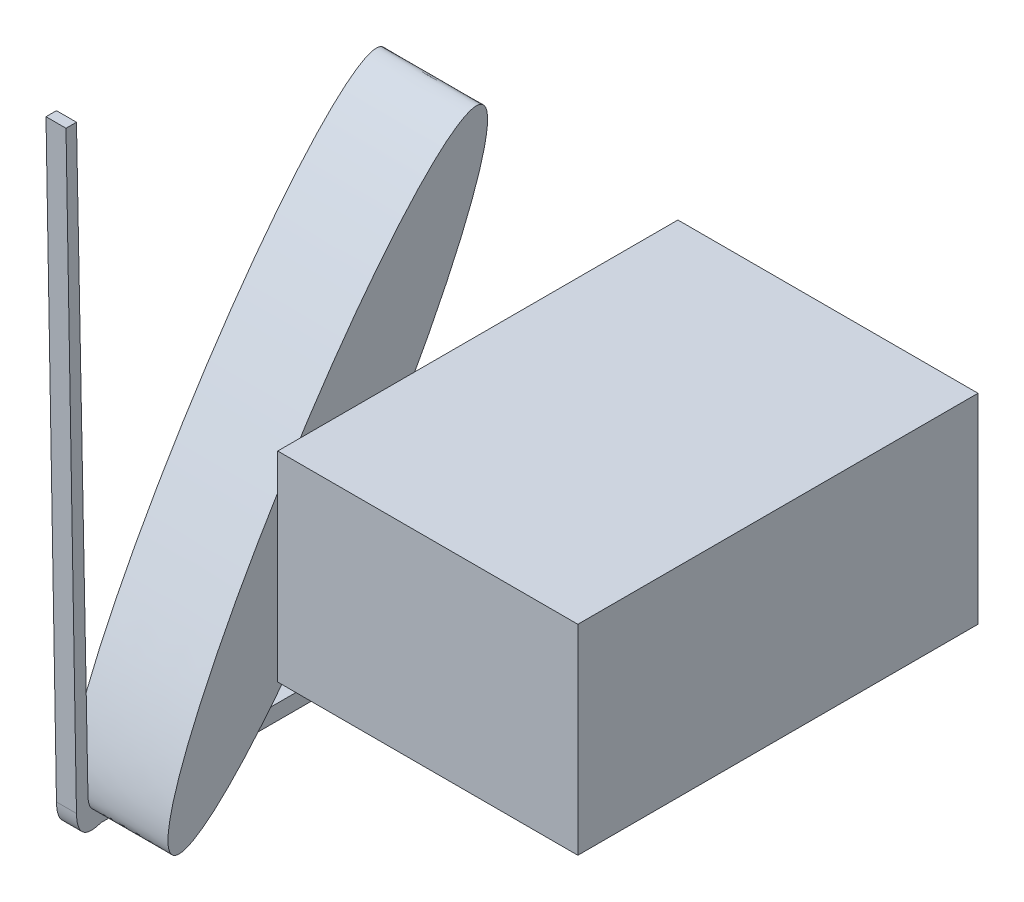
ISO-10303-21;
HEADER;
FILE_DESCRIPTION(('STEP AP214'),'2;1');
FILE_NAME('part.step','',(''),(''),'','','');
FILE_SCHEMA(('AUTOMOTIVE_DESIGN { 1 0 10303 214 1 1 1 1 }'));
ENDSEC;
DATA;
#1=APPLICATION_CONTEXT('core data for automotive mechanical design processes');
#2=APPLICATION_PROTOCOL_DEFINITION('international standard','automotive_design',2000,#1);
#3=PRODUCT_CONTEXT('',#1,'mechanical');
#4=PRODUCT('Part','Part','',(#3));
#5=PRODUCT_RELATED_PRODUCT_CATEGORY('part','',(#4));
#6=PRODUCT_DEFINITION_FORMATION('','',#4);
#7=PRODUCT_DEFINITION_CONTEXT('part definition',#1,'design');
#8=PRODUCT_DEFINITION('design','',#6,#7);
#9=PRODUCT_DEFINITION_SHAPE('','',#8);
#10=(LENGTH_UNIT() NAMED_UNIT(*) SI_UNIT(.MILLI.,.METRE.));
#11=(NAMED_UNIT(*) PLANE_ANGLE_UNIT() SI_UNIT($,.RADIAN.));
#12=(NAMED_UNIT(*) SI_UNIT($,.STERADIAN.) SOLID_ANGLE_UNIT());
#13=UNCERTAINTY_MEASURE_WITH_UNIT(LENGTH_MEASURE(1.E-05),#10,'distance_accuracy_value','');
#14=(GEOMETRIC_REPRESENTATION_CONTEXT(3) GLOBAL_UNCERTAINTY_ASSIGNED_CONTEXT((#13)) GLOBAL_UNIT_ASSIGNED_CONTEXT((#10,
#11,#12)) REPRESENTATION_CONTEXT('',''));
#15=CARTESIAN_POINT('',(0.,0.,0.));
#16=DIRECTION('',(0.,0.,1.));
#17=DIRECTION('',(1.,0.,0.));
#18=AXIS2_PLACEMENT_3D('',#15,#16,#17);
#19=CARTESIAN_POINT('',(0.,0.,40.));
#20=DIRECTION('',(1.,0.,0.));
#21=DIRECTION('',(0.,0.,-1.));
#22=AXIS2_PLACEMENT_3D('',#19,#20,#21);
#23=PLANE('',#22);
#24=CARTESIAN_POINT('',(0.,10.,30.));
#25=DIRECTION('',(1.,0.,0.));
#26=DIRECTION('',(0.,0.,-1.));
#27=AXIS2_PLACEMENT_3D('',#24,#25,#26);
#28=CIRCLE('',#27,2.);
#29=CARTESIAN_POINT('',(0.,10.,28.));
#30=VERTEX_POINT('',#29);
#31=EDGE_CURVE('E11',#30,#30,#28,.F.);
#32=ORIENTED_EDGE('',*,*,#31,.F.);
#33=EDGE_LOOP('',(#32));
#34=FACE_BOUND('',#33,.T.);
#35=DIRECTION('',(0.,-1.,0.));
#36=VECTOR('',#35,1.);
#37=CARTESIAN_POINT('',(0.,0.,0.));
#38=LINE('',#37,#36);
#39=CARTESIAN_POINT('',(0.,20.,0.));
#40=VERTEX_POINT('',#39);
#41=CARTESIAN_POINT('',(0.,0.,0.));
#42=VERTEX_POINT('',#41);
#43=EDGE_CURVE('E211',#40,#42,#38,.T.);
#44=ORIENTED_EDGE('',*,*,#43,.T.);
#45=DIRECTION('',(0.,0.,-1.));
#46=VECTOR('',#45,1.);
#47=CARTESIAN_POINT('',(0.,0.,40.));
#48=LINE('',#47,#46);
#49=CARTESIAN_POINT('',(0.,0.,40.));
#50=VERTEX_POINT('',#49);
#51=EDGE_CURVE('E51',#50,#42,#48,.T.);
#52=ORIENTED_EDGE('',*,*,#51,.F.);
#53=DIRECTION('',(0.,-1.,0.));
#54=VECTOR('',#53,1.);
#55=CARTESIAN_POINT('',(0.,0.,40.));
#56=LINE('',#55,#54);
#57=CARTESIAN_POINT('',(0.,20.,40.));
#58=VERTEX_POINT('',#57);
#59=EDGE_CURVE('E212',#58,#50,#56,.T.);
#60=ORIENTED_EDGE('',*,*,#59,.F.);
#61=DIRECTION('',(0.,0.,-1.));
#62=VECTOR('',#61,1.);
#63=CARTESIAN_POINT('',(0.,20.,40.));
#64=LINE('',#63,#62);
#65=EDGE_CURVE('E222',#58,#40,#64,.T.);
#66=ORIENTED_EDGE('',*,*,#65,.T.);
#67=EDGE_LOOP('',(#44,#52,#60,#66));
#68=FACE_BOUND('',#67,.T.);
#69=ADVANCED_FACE('F43',(#34,#68),#23,.F.);
#70=CARTESIAN_POINT('',(0.,0.,40.));
#71=DIRECTION('',(0.,1.,0.));
#72=DIRECTION('',(0.,0.,1.));
#73=AXIS2_PLACEMENT_3D('',#70,#71,#72);
#74=PLANE('',#73);
#75=DIRECTION('',(1.,0.,0.));
#76=VECTOR('',#75,1.);
#77=CARTESIAN_POINT('',(0.,0.,0.));
#78=LINE('',#77,#76);
#79=CARTESIAN_POINT('',(30.,0.,0.));
#80=VERTEX_POINT('',#79);
#81=EDGE_CURVE('E226',#42,#80,#78,.T.);
#82=ORIENTED_EDGE('',*,*,#81,.T.);
#83=DIRECTION('',(0.,0.,-1.));
#84=VECTOR('',#83,1.);
#85=CARTESIAN_POINT('',(30.,0.,40.));
#86=LINE('',#85,#84);
#87=CARTESIAN_POINT('',(30.,0.,40.));
#88=VERTEX_POINT('',#87);
#89=EDGE_CURVE('E239',#88,#80,#86,.T.);
#90=ORIENTED_EDGE('',*,*,#89,.F.);
#91=DIRECTION('',(1.,0.,0.));
#92=VECTOR('',#91,1.);
#93=CARTESIAN_POINT('',(0.,0.,40.));
#94=LINE('',#93,#92);
#95=EDGE_CURVE('E96',#50,#88,#94,.T.);
#96=ORIENTED_EDGE('',*,*,#95,.F.);
#97=ORIENTED_EDGE('',*,*,#51,.T.);
#98=EDGE_LOOP('',(#82,#90,#96,#97));
#99=FACE_BOUND('',#98,.T.);
#100=ADVANCED_FACE('F244',(#99),#74,.F.);
#101=CARTESIAN_POINT('',(30.,0.,40.));
#102=DIRECTION('',(-1.,0.,0.));
#103=DIRECTION('',(0.,0.,1.));
#104=AXIS2_PLACEMENT_3D('',#101,#102,#103);
#105=PLANE('',#104);
#106=DIRECTION('',(0.,1.,0.));
#107=VECTOR('',#106,1.);
#108=CARTESIAN_POINT('',(30.,0.,0.));
#109=LINE('',#108,#107);
#110=CARTESIAN_POINT('',(30.,20.,0.));
#111=VERTEX_POINT('',#110);
#112=EDGE_CURVE('E229',#80,#111,#109,.T.);
#113=ORIENTED_EDGE('',*,*,#112,.T.);
#114=DIRECTION('',(0.,0.,-1.));
#115=VECTOR('',#114,1.);
#116=CARTESIAN_POINT('',(30.,20.,40.));
#117=LINE('',#116,#115);
#118=CARTESIAN_POINT('',(30.,20.,40.));
#119=VERTEX_POINT('',#118);
#120=EDGE_CURVE('E236',#119,#111,#117,.T.);
#121=ORIENTED_EDGE('',*,*,#120,.F.);
#122=DIRECTION('',(0.,1.,0.));
#123=VECTOR('',#122,1.);
#124=CARTESIAN_POINT('',(30.,0.,40.));
#125=LINE('',#124,#123);
#126=EDGE_CURVE('E217',#88,#119,#125,.T.);
#127=ORIENTED_EDGE('',*,*,#126,.F.);
#128=ORIENTED_EDGE('',*,*,#89,.T.);
#129=EDGE_LOOP('',(#113,#121,#127,#128));
#130=FACE_BOUND('',#129,.T.);
#131=ADVANCED_FACE('F253',(#130),#105,.F.);
#132=CARTESIAN_POINT('',(0.,20.,40.));
#133=DIRECTION('',(0.,-1.,0.));
#134=DIRECTION('',(0.,0.,-1.));
#135=AXIS2_PLACEMENT_3D('',#132,#133,#134);
#136=PLANE('',#135);
#137=DIRECTION('',(-1.,0.,0.));
#138=VECTOR('',#137,1.);
#139=CARTESIAN_POINT('',(0.,20.,0.));
#140=LINE('',#139,#138);
#141=EDGE_CURVE('E88',#111,#40,#140,.T.);
#142=ORIENTED_EDGE('',*,*,#141,.T.);
#143=ORIENTED_EDGE('',*,*,#65,.F.);
#144=DIRECTION('',(-1.,0.,0.));
#145=VECTOR('',#144,1.);
#146=CARTESIAN_POINT('',(0.,20.,40.));
#147=LINE('',#146,#145);
#148=EDGE_CURVE('E67',#119,#58,#147,.T.);
#149=ORIENTED_EDGE('',*,*,#148,.F.);
#150=ORIENTED_EDGE('',*,*,#120,.T.);
#151=EDGE_LOOP('',(#142,#143,#149,#150));
#152=FACE_BOUND('',#151,.T.);
#153=ADVANCED_FACE('F255',(#152),#136,.F.);
#154=CARTESIAN_POINT('',(0.,0.,40.));
#155=DIRECTION('',(0.,0.,-1.));
#156=DIRECTION('',(-1.,0.,0.));
#157=AXIS2_PLACEMENT_3D('',#154,#155,#156);
#158=PLANE('',#157);
#159=ORIENTED_EDGE('',*,*,#59,.T.);
#160=ORIENTED_EDGE('',*,*,#95,.T.);
#161=ORIENTED_EDGE('',*,*,#126,.T.);
#162=ORIENTED_EDGE('',*,*,#148,.T.);
#163=EDGE_LOOP('',(#159,#160,#161,#162));
#164=FACE_BOUND('',#163,.T.);
#165=ADVANCED_FACE('F256',(#164),#158,.F.);
#166=CARTESIAN_POINT('',(0.,0.,0.));
#167=DIRECTION('',(0.,0.,-1.));
#168=DIRECTION('',(-1.,0.,0.));
#169=AXIS2_PLACEMENT_3D('',#166,#167,#168);
#170=PLANE('',#169);
#171=ORIENTED_EDGE('',*,*,#43,.F.);
#172=ORIENTED_EDGE('',*,*,#141,.F.);
#173=ORIENTED_EDGE('',*,*,#112,.F.);
#174=ORIENTED_EDGE('',*,*,#81,.F.);
#175=EDGE_LOOP('',(#171,#172,#173,#174));
#176=FACE_BOUND('',#175,.T.);
#177=ADVANCED_FACE('F249',(#176),#170,.T.);
#178=CARTESIAN_POINT('',(-5.,10.,30.));
#179=DIRECTION('',(1.,0.,0.));
#180=DIRECTION('',(0.,0.,-1.));
#181=AXIS2_PLACEMENT_3D('',#178,#179,#180);
#182=CYLINDRICAL_SURFACE('',#181,2.);
#183=CARTESIAN_POINT('',(-5.,10.,30.));
#184=DIRECTION('',(-1.,0.,0.));
#185=DIRECTION('',(0.,0.,1.));
#186=AXIS2_PLACEMENT_3D('',#183,#184,#185);
#187=CIRCLE('',#186,2.);
#188=CARTESIAN_POINT('',(-5.,10.,32.));
#189=VERTEX_POINT('',#188);
#190=EDGE_CURVE('E202',#189,#189,#187,.T.);
#191=ORIENTED_EDGE('',*,*,#190,.F.);
#192=EDGE_LOOP('',(#191));
#193=FACE_BOUND('',#192,.T.);
#194=ORIENTED_EDGE('',*,*,#31,.T.);
#195=EDGE_LOOP('',(#194));
#196=FACE_BOUND('',#195,.T.);
#197=ADVANCED_FACE('F195',(#193,#196),#182,.T.);
#198=CARTESIAN_POINT('',(-15.,10.,30.));
#199=DIRECTION('',(-1.,0.,0.));
#200=DIRECTION('',(0.,0.849737497764281,-0.527206017504825));
#201=AXIS2_PLACEMENT_3D('',#198,#199,#200);
#202=ELLIPSE('',#201,29.2044221195247,5.);
#203=DIRECTION('',(1.,0.,0.));
#204=VECTOR('',#203,1.);
#205=SURFACE_OF_LINEAR_EXTRUSION('',#202,#204);
#206=CARTESIAN_POINT('',(-13.,10.,30.));
#207=DIRECTION('',(-1.,0.,0.));
#208=DIRECTION('',(0.,0.849737497764281,-0.527206017504825));
#209=AXIS2_PLACEMENT_3D('',#206,#207,#208);
#210=ELLIPSE('',#209,29.2044221195247,5.);
#211=CARTESIAN_POINT('',(-13.,-14.8160925754968,44.1606306802219));
#212=VERTEX_POINT('',#211);
#213=CARTESIAN_POINT('',(-13.,-13.318705729516,45.9712582891793));
#214=VERTEX_POINT('',#213);
#215=EDGE_CURVE('E503',#212,#214,#210,.T.);
#216=ORIENTED_EDGE('',*,*,#215,.F.);
#217=DIRECTION('',(-1.,0.,0.));
#218=VECTOR('',#217,1.);
#219=CARTESIAN_POINT('',(-13.,-14.8160925754968,44.1606306802219));
#220=LINE('',#219,#218);
#221=CARTESIAN_POINT('',(-15.,-14.8160925754968,44.1606306802219));
#222=VERTEX_POINT('',#221);
#223=EDGE_CURVE('E485',#212,#222,#220,.T.);
#224=ORIENTED_EDGE('',*,*,#223,.T.);
#225=CARTESIAN_POINT('',(-15.,-13.318705729516,45.9712582891793));
#226=VERTEX_POINT('',#225);
#227=EDGE_CURVE('E198',#226,#222,#202,.T.);
#228=ORIENTED_EDGE('',*,*,#227,.F.);
#229=DIRECTION('',(-1.,0.,0.));
#230=VECTOR('',#229,1.);
#231=CARTESIAN_POINT('',(-13.,-13.318705729516,45.9712582891793));
#232=LINE('',#231,#230);
#233=EDGE_CURVE('E489',#214,#226,#232,.T.);
#234=ORIENTED_EDGE('',*,*,#233,.F.);
#235=EDGE_LOOP('',(#216,#224,#228,#234));
#236=FACE_BOUND('',#235,.T.);
#237=CARTESIAN_POINT('',(-5.,10.,30.));
#238=DIRECTION('',(-1.,0.,0.));
#239=DIRECTION('',(0.,0.849737497764281,-0.527206017504825));
#240=AXIS2_PLACEMENT_3D('',#237,#238,#239);
#241=ELLIPSE('',#240,29.2044221195247,5.);
#242=CARTESIAN_POINT('',(-5.,34.8160925754968,14.6032529208355));
#243=VERTEX_POINT('',#242);
#244=EDGE_CURVE('E203',#243,#243,#241,.T.);
#245=ORIENTED_EDGE('',*,*,#244,.T.);
#246=EDGE_LOOP('',(#245));
#247=FACE_BOUND('',#246,.T.);
#248=ADVANCED_FACE('F188',(#236,#247),#205,.F.);
#249=CARTESIAN_POINT('',(-15.,10.,30.));
#250=DIRECTION('',(-1.,0.,0.));
#251=DIRECTION('',(0.,0.,1.));
#252=AXIS2_PLACEMENT_3D('',#249,#250,#251);
#253=PLANE('',#252);
#254=ORIENTED_EDGE('',*,*,#227,.T.);
#255=DIRECTION('',(0.,0.,-1.));
#256=VECTOR('',#255,1.);
#257=CARTESIAN_POINT('',(-15.,-14.8160925754968,0.));
#258=LINE('',#257,#256);
#259=CARTESIAN_POINT('',(-15.,-14.8160925754968,0.));
#260=VERTEX_POINT('',#259);
#261=EDGE_CURVE('E470',#222,#260,#258,.T.);
#262=ORIENTED_EDGE('',*,*,#261,.T.);
#263=DIRECTION('',(0.,-1.,0.));
#264=VECTOR('',#263,1.);
#265=CARTESIAN_POINT('',(-15.,0.,0.));
#266=LINE('',#265,#264);
#267=CARTESIAN_POINT('',(-15.,-16.3418624306927,0.));
#268=VERTEX_POINT('',#267);
#269=EDGE_CURVE('E174',#260,#268,#266,.T.);
#270=ORIENTED_EDGE('',*,*,#269,.T.);
#271=DIRECTION('',(0.,0.,-1.));
#272=VECTOR('',#271,1.);
#273=CARTESIAN_POINT('',(-15.,-16.3418624306927,0.));
#274=LINE('',#273,#272);
#275=CARTESIAN_POINT('',(-15.,-16.3418624306927,44.671665842884));
#276=VERTEX_POINT('',#275);
#277=EDGE_CURVE('E170',#276,#268,#274,.T.);
#278=ORIENTED_EDGE('',*,*,#277,.F.);
#279=CARTESIAN_POINT('',(-15.,10.,30.));
#280=DIRECTION('',(-1.,0.,0.));
#281=DIRECTION('',(0.,-0.849737497764281,0.527206017504826));
#282=AXIS2_PLACEMENT_3D('',#279,#280,#281);
#283=ELLIPSE('',#282,31.,6.);
#284=CARTESIAN_POINT('',(-15.,-14.3208239459923,47.1191671529726));
#285=VERTEX_POINT('',#284);
#286=EDGE_CURVE('E461',#276,#285,#283,.T.);
#287=ORIENTED_EDGE('',*,*,#286,.T.);
#288=DIRECTION('',(0.,0.999847286593968,0.01747579728307));
#289=VECTOR('',#288,1.);
#290=CARTESIAN_POINT('',(-15.,-0.827692891842284,47.3550063918023));
#291=LINE('',#290,#289);
#292=CARTESIAN_POINT('',(-15.,45.5235757007451,48.1651554861671));
#293=VERTEX_POINT('',#292);
#294=EDGE_CURVE('E148',#285,#293,#291,.T.);
#295=ORIENTED_EDGE('',*,*,#294,.T.);
#296=DIRECTION('',(0.,0.,1.));
#297=VECTOR('',#296,1.);
#298=CARTESIAN_POINT('',(-15.,45.5235757007451,0.));
#299=LINE('',#298,#297);
#300=CARTESIAN_POINT('',(-15.,45.5235757007451,47.1191671529726));
#301=VERTEX_POINT('',#300);
#302=EDGE_CURVE('E455',#301,#293,#299,.T.);
#303=ORIENTED_EDGE('',*,*,#302,.F.);
#304=DIRECTION('',(0.,0.999809768742347,0.0195045206907333));
#305=VECTOR('',#304,1.);
#306=CARTESIAN_POINT('',(-15.,-0.901543574431739,46.2134951663791));
#307=LINE('',#306,#305);
#308=EDGE_CURVE('E58',#226,#301,#307,.T.);
#309=ORIENTED_EDGE('',*,*,#308,.F.);
#310=EDGE_LOOP('',(#254,#262,#270,#278,#287,#295,#303,#309));
#311=FACE_BOUND('',#310,.T.);
#312=ADVANCED_FACE('F185',(#311),#253,.T.);
#313=CARTESIAN_POINT('',(-5.,10.,30.));
#314=DIRECTION('',(-1.,0.,0.));
#315=DIRECTION('',(0.,0.,1.));
#316=AXIS2_PLACEMENT_3D('',#313,#314,#315);
#317=PLANE('',#316);
#318=ORIENTED_EDGE('',*,*,#190,.T.);
#319=EDGE_LOOP('',(#318));
#320=FACE_BOUND('',#319,.T.);
#321=ORIENTED_EDGE('',*,*,#244,.F.);
#322=EDGE_LOOP('',(#321));
#323=FACE_BOUND('',#322,.T.);
#324=ADVANCED_FACE('F183',(#320,#323),#317,.F.);
#325=CARTESIAN_POINT('',(-13.,10.,30.));
#326=DIRECTION('',(-1.,0.,0.));
#327=DIRECTION('',(0.,-0.849737497764281,0.527206017504826));
#328=AXIS2_PLACEMENT_3D('',#325,#326,#327);
#329=ELLIPSE('',#328,31.,6.);
#330=DIRECTION('',(-1.,0.,0.));
#331=VECTOR('',#330,1.);
#332=SURFACE_OF_LINEAR_EXTRUSION('',#329,#331);
#333=ORIENTED_EDGE('',*,*,#286,.F.);
#334=DIRECTION('',(-1.,0.,0.));
#335=VECTOR('',#334,1.);
#336=CARTESIAN_POINT('',(-13.,-16.3418624306927,44.671665842884));
#337=LINE('',#336,#335);
#338=CARTESIAN_POINT('',(-13.,-16.3418624306927,44.671665842884));
#339=VERTEX_POINT('',#338);
#340=EDGE_CURVE('E167',#339,#276,#337,.T.);
#341=ORIENTED_EDGE('',*,*,#340,.F.);
#342=CARTESIAN_POINT('',(-13.,-14.3208239459923,47.1191671529726));
#343=VERTEX_POINT('',#342);
#344=EDGE_CURVE('E160',#339,#343,#329,.T.);
#345=ORIENTED_EDGE('',*,*,#344,.T.);
#346=DIRECTION('',(-1.,0.,0.));
#347=VECTOR('',#346,1.);
#348=CARTESIAN_POINT('',(-13.,-14.3208239459923,47.1191671529726));
#349=LINE('',#348,#347);
#350=EDGE_CURVE('E143',#343,#285,#349,.T.);
#351=ORIENTED_EDGE('',*,*,#350,.T.);
#352=EDGE_LOOP('',(#333,#341,#345,#351));
#353=FACE_BOUND('',#352,.T.);
#354=ADVANCED_FACE('F166',(#353),#332,.T.);
#355=CARTESIAN_POINT('',(-13.,-16.3418624306927,0.));
#356=DIRECTION('',(0.,1.,0.));
#357=DIRECTION('',(0.,0.,1.));
#358=AXIS2_PLACEMENT_3D('',#355,#356,#357);
#359=PLANE('',#358);
#360=ORIENTED_EDGE('',*,*,#277,.T.);
#361=DIRECTION('',(-1.,0.,0.));
#362=VECTOR('',#361,1.);
#363=CARTESIAN_POINT('',(-13.,-16.3418624306927,0.));
#364=LINE('',#363,#362);
#365=CARTESIAN_POINT('',(-13.,-16.3418624306927,0.));
#366=VERTEX_POINT('',#365);
#367=EDGE_CURVE('E479',#366,#268,#364,.T.);
#368=ORIENTED_EDGE('',*,*,#367,.F.);
#369=DIRECTION('',(0.,0.,-1.));
#370=VECTOR('',#369,1.);
#371=CARTESIAN_POINT('',(-13.,-16.3418624306927,0.));
#372=LINE('',#371,#370);
#373=EDGE_CURVE('E155',#339,#366,#372,.T.);
#374=ORIENTED_EDGE('',*,*,#373,.F.);
#375=ORIENTED_EDGE('',*,*,#340,.T.);
#376=EDGE_LOOP('',(#360,#368,#374,#375));
#377=FACE_BOUND('',#376,.T.);
#378=ADVANCED_FACE('F182',(#377),#359,.F.);
#379=CARTESIAN_POINT('',(-13.,0.,0.));
#380=DIRECTION('',(0.,0.,-1.));
#381=DIRECTION('',(-1.,0.,0.));
#382=AXIS2_PLACEMENT_3D('',#379,#380,#381);
#383=PLANE('',#382);
#384=ORIENTED_EDGE('',*,*,#269,.F.);
#385=DIRECTION('',(-1.,0.,0.));
#386=VECTOR('',#385,1.);
#387=CARTESIAN_POINT('',(-13.,-14.8160925754968,0.));
#388=LINE('',#387,#386);
#389=CARTESIAN_POINT('',(-13.,-14.8160925754968,0.));
#390=VERTEX_POINT('',#389);
#391=EDGE_CURVE('E482',#390,#260,#388,.T.);
#392=ORIENTED_EDGE('',*,*,#391,.F.);
#393=DIRECTION('',(0.,-1.,0.));
#394=VECTOR('',#393,1.);
#395=CARTESIAN_POINT('',(-13.,0.,0.));
#396=LINE('',#395,#394);
#397=EDGE_CURVE('E496',#390,#366,#396,.T.);
#398=ORIENTED_EDGE('',*,*,#397,.T.);
#399=ORIENTED_EDGE('',*,*,#367,.T.);
#400=EDGE_LOOP('',(#384,#392,#398,#399));
#401=FACE_BOUND('',#400,.T.);
#402=ADVANCED_FACE('F304',(#401),#383,.T.);
#403=CARTESIAN_POINT('',(-13.,-14.8160925754968,0.));
#404=DIRECTION('',(0.,1.,0.));
#405=DIRECTION('',(0.,0.,1.));
#406=AXIS2_PLACEMENT_3D('',#403,#404,#405);
#407=PLANE('',#406);
#408=ORIENTED_EDGE('',*,*,#261,.F.);
#409=ORIENTED_EDGE('',*,*,#223,.F.);
#410=DIRECTION('',(0.,0.,-1.));
#411=VECTOR('',#410,1.);
#412=CARTESIAN_POINT('',(-13.,-14.8160925754968,0.));
#413=LINE('',#412,#411);
#414=EDGE_CURVE('E499',#212,#390,#413,.T.);
#415=ORIENTED_EDGE('',*,*,#414,.T.);
#416=ORIENTED_EDGE('',*,*,#391,.T.);
#417=EDGE_LOOP('',(#408,#409,#415,#416));
#418=FACE_BOUND('',#417,.T.);
#419=ADVANCED_FACE('F313',(#418),#407,.T.);
#420=CARTESIAN_POINT('',(-13.,-0.901543574431739,46.2134951663791));
#421=DIRECTION('',(0.,-0.0195045206907333,0.999809768742347));
#422=DIRECTION('',(0.,-0.999809768742347,-0.0195045206907333));
#423=AXIS2_PLACEMENT_3D('',#420,#421,#422);
#424=PLANE('',#423);
#425=ORIENTED_EDGE('',*,*,#308,.T.);
#426=DIRECTION('',(-1.,0.,0.));
#427=VECTOR('',#426,1.);
#428=CARTESIAN_POINT('',(-13.,45.5235757007451,47.1191671529726));
#429=LINE('',#428,#427);
#430=CARTESIAN_POINT('',(-13.,45.5235757007451,47.1191671529726));
#431=VERTEX_POINT('',#430);
#432=EDGE_CURVE('E457',#431,#301,#429,.T.);
#433=ORIENTED_EDGE('',*,*,#432,.F.);
#434=DIRECTION('',(0.,0.999809768742347,0.0195045206907333));
#435=VECTOR('',#434,1.);
#436=CARTESIAN_POINT('',(-13.,-0.901543574431739,46.2134951663791));
#437=LINE('',#436,#435);
#438=EDGE_CURVE('E506',#214,#431,#437,.T.);
#439=ORIENTED_EDGE('',*,*,#438,.F.);
#440=ORIENTED_EDGE('',*,*,#233,.T.);
#441=EDGE_LOOP('',(#425,#433,#439,#440));
#442=FACE_BOUND('',#441,.T.);
#443=ADVANCED_FACE('F321',(#442),#424,.F.);
#444=CARTESIAN_POINT('',(-13.,45.5235757007451,0.));
#445=DIRECTION('',(0.,-1.,0.));
#446=DIRECTION('',(0.,0.,-1.));
#447=AXIS2_PLACEMENT_3D('',#444,#445,#446);
#448=PLANE('',#447);
#449=ORIENTED_EDGE('',*,*,#302,.T.);
#450=DIRECTION('',(-1.,0.,0.));
#451=VECTOR('',#450,1.);
#452=CARTESIAN_POINT('',(-13.,45.5235757007451,48.1651554861671));
#453=LINE('',#452,#451);
#454=CARTESIAN_POINT('',(-13.,45.5235757007451,48.1651554861671));
#455=VERTEX_POINT('',#454);
#456=EDGE_CURVE('E154',#455,#293,#453,.T.);
#457=ORIENTED_EDGE('',*,*,#456,.F.);
#458=DIRECTION('',(0.,0.,1.));
#459=VECTOR('',#458,1.);
#460=CARTESIAN_POINT('',(-13.,45.5235757007451,0.));
#461=LINE('',#460,#459);
#462=EDGE_CURVE('E162',#431,#455,#461,.T.);
#463=ORIENTED_EDGE('',*,*,#462,.F.);
#464=ORIENTED_EDGE('',*,*,#432,.T.);
#465=EDGE_LOOP('',(#449,#457,#463,#464));
#466=FACE_BOUND('',#465,.T.);
#467=ADVANCED_FACE('F329',(#466),#448,.F.);
#468=CARTESIAN_POINT('',(-13.,-0.827692891842284,47.3550063918023));
#469=DIRECTION('',(0.,-0.01747579728307,0.999847286593968));
#470=DIRECTION('',(0.,-0.999847286593968,-0.01747579728307));
#471=AXIS2_PLACEMENT_3D('',#468,#469,#470);
#472=PLANE('',#471);
#473=ORIENTED_EDGE('',*,*,#294,.F.);
#474=ORIENTED_EDGE('',*,*,#350,.F.);
#475=DIRECTION('',(0.,0.999847286593968,0.01747579728307));
#476=VECTOR('',#475,1.);
#477=CARTESIAN_POINT('',(-13.,-0.827692891842284,47.3550063918023));
#478=LINE('',#477,#476);
#479=EDGE_CURVE('E146',#343,#455,#478,.T.);
#480=ORIENTED_EDGE('',*,*,#479,.T.);
#481=ORIENTED_EDGE('',*,*,#456,.T.);
#482=EDGE_LOOP('',(#473,#474,#480,#481));
#483=FACE_BOUND('',#482,.T.);
#484=ADVANCED_FACE('F145',(#483),#472,.T.);
#485=CARTESIAN_POINT('',(-13.,0.,0.));
#486=DIRECTION('',(-1.,0.,0.));
#487=DIRECTION('',(0.,0.,1.));
#488=AXIS2_PLACEMENT_3D('',#485,#486,#487);
#489=PLANE('',#488);
#490=ORIENTED_EDGE('',*,*,#344,.F.);
#491=ORIENTED_EDGE('',*,*,#373,.T.);
#492=ORIENTED_EDGE('',*,*,#397,.F.);
#493=ORIENTED_EDGE('',*,*,#414,.F.);
#494=ORIENTED_EDGE('',*,*,#215,.T.);
#495=ORIENTED_EDGE('',*,*,#438,.T.);
#496=ORIENTED_EDGE('',*,*,#462,.T.);
#497=ORIENTED_EDGE('',*,*,#479,.F.);
#498=EDGE_LOOP('',(#490,#491,#492,#493,#494,#495,#496,#497));
#499=FACE_BOUND('',#498,.T.);
#500=ADVANCED_FACE('F159',(#499),#489,.F.);
#501=CLOSED_SHELL('',(#69,#100,#131,#153,#165,#177,#197,#248,#312,#324,#354,#378,#402,#419,#443,
#467,#484,#500));
#502=MANIFOLD_SOLID_BREP('B2',#501);
#503=ADVANCED_BREP_SHAPE_REPRESENTATION('',(#18,#502),#14);
#504=SHAPE_DEFINITION_REPRESENTATION(#9,#503);
ENDSEC;
END-ISO-10303-21;
